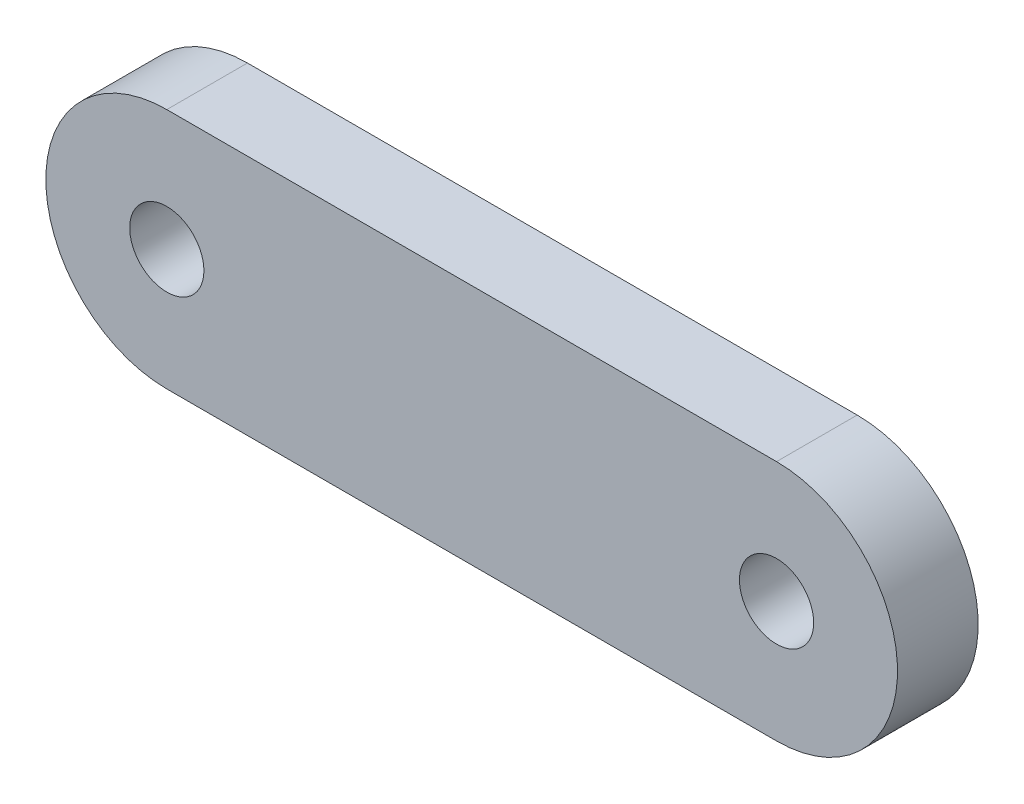
ISO-10303-21;
HEADER;
FILE_DESCRIPTION(('STEP AP214'),'2;1');
FILE_NAME('part.step','',(''),(''),'','','');
FILE_SCHEMA(('AUTOMOTIVE_DESIGN { 1 0 10303 214 1 1 1 1 }'));
ENDSEC;
DATA;
#1=APPLICATION_CONTEXT('core data for automotive mechanical design processes');
#2=APPLICATION_PROTOCOL_DEFINITION('international standard','automotive_design',2000,#1);
#3=PRODUCT_CONTEXT('',#1,'mechanical');
#4=PRODUCT('Part','Part','',(#3));
#5=PRODUCT_RELATED_PRODUCT_CATEGORY('part','',(#4));
#6=PRODUCT_DEFINITION_FORMATION('','',#4);
#7=PRODUCT_DEFINITION_CONTEXT('part definition',#1,'design');
#8=PRODUCT_DEFINITION('design','',#6,#7);
#9=PRODUCT_DEFINITION_SHAPE('','',#8);
#10=(LENGTH_UNIT() NAMED_UNIT(*) SI_UNIT(.MILLI.,.METRE.));
#11=(NAMED_UNIT(*) PLANE_ANGLE_UNIT() SI_UNIT($,.RADIAN.));
#12=(NAMED_UNIT(*) SI_UNIT($,.STERADIAN.) SOLID_ANGLE_UNIT());
#13=UNCERTAINTY_MEASURE_WITH_UNIT(LENGTH_MEASURE(1.E-05),#10,'distance_accuracy_value','');
#14=(GEOMETRIC_REPRESENTATION_CONTEXT(3) GLOBAL_UNCERTAINTY_ASSIGNED_CONTEXT((#13)) GLOBAL_UNIT_ASSIGNED_CONTEXT((#10,
#11,#12)) REPRESENTATION_CONTEXT('',''));
#15=CARTESIAN_POINT('',(0.,0.,0.));
#16=DIRECTION('',(0.,0.,1.));
#17=DIRECTION('',(1.,0.,0.));
#18=AXIS2_PLACEMENT_3D('',#15,#16,#17);
#19=CARTESIAN_POINT('',(18.9,0.,5.));
#20=DIRECTION('',(0.,0.,-1.));
#21=DIRECTION('',(-1.,0.,0.));
#22=AXIS2_PLACEMENT_3D('',#19,#20,#21);
#23=PLANE('',#22);
#24=CARTESIAN_POINT('',(18.9,0.,5.));
#25=DIRECTION('',(0.,0.,1.));
#26=DIRECTION('',(-1.,0.,0.));
#27=AXIS2_PLACEMENT_3D('',#24,#25,#26);
#28=CIRCLE('',#27,7.5);
#29=CARTESIAN_POINT('',(18.9,-7.5,5.));
#30=VERTEX_POINT('',#29);
#31=CARTESIAN_POINT('',(18.9,7.5,5.));
#32=VERTEX_POINT('',#31);
#33=EDGE_CURVE('E87',#30,#32,#28,.T.);
#34=ORIENTED_EDGE('',*,*,#33,.T.);
#35=DIRECTION('',(-1.,0.,0.));
#36=VECTOR('',#35,1.);
#37=CARTESIAN_POINT('',(-18.9,7.5,5.));
#38=LINE('',#37,#36);
#39=CARTESIAN_POINT('',(-18.9,7.5,5.));
#40=VERTEX_POINT('',#39);
#41=EDGE_CURVE('E82',#32,#40,#38,.T.);
#42=ORIENTED_EDGE('',*,*,#41,.T.);
#43=CARTESIAN_POINT('',(-18.9,0.,5.));
#44=DIRECTION('',(0.,0.,1.));
#45=DIRECTION('',(1.,0.,0.));
#46=AXIS2_PLACEMENT_3D('',#43,#44,#45);
#47=CIRCLE('',#46,7.5);
#48=CARTESIAN_POINT('',(-18.9,-7.5,5.));
#49=VERTEX_POINT('',#48);
#50=EDGE_CURVE('E85',#40,#49,#47,.T.);
#51=ORIENTED_EDGE('',*,*,#50,.T.);
#52=DIRECTION('',(1.,0.,0.));
#53=VECTOR('',#52,1.);
#54=CARTESIAN_POINT('',(-18.9,-7.5,5.));
#55=LINE('',#54,#53);
#56=EDGE_CURVE('E52',#49,#30,#55,.T.);
#57=ORIENTED_EDGE('',*,*,#56,.T.);
#58=EDGE_LOOP('',(#34,#42,#51,#57));
#59=FACE_BOUND('',#58,.T.);
#60=CARTESIAN_POINT('',(-18.9,0.,5.));
#61=DIRECTION('',(0.,0.,1.));
#62=DIRECTION('',(1.,0.,0.));
#63=AXIS2_PLACEMENT_3D('',#60,#61,#62);
#64=CIRCLE('',#63,2.29999999999999);
#65=CARTESIAN_POINT('',(-16.6,0.,5.));
#66=VERTEX_POINT('',#65);
#67=EDGE_CURVE('E102',#66,#66,#64,.T.);
#68=ORIENTED_EDGE('',*,*,#67,.F.);
#69=EDGE_LOOP('',(#68));
#70=FACE_BOUND('',#69,.T.);
#71=CARTESIAN_POINT('',(18.9,0.,5.));
#72=DIRECTION('',(0.,0.,1.));
#73=DIRECTION('',(1.,0.,0.));
#74=AXIS2_PLACEMENT_3D('',#71,#72,#73);
#75=CIRCLE('',#74,2.30000000000001);
#76=CARTESIAN_POINT('',(21.2,0.,5.));
#77=VERTEX_POINT('',#76);
#78=EDGE_CURVE('E117',#77,#77,#75,.T.);
#79=ORIENTED_EDGE('',*,*,#78,.F.);
#80=EDGE_LOOP('',(#79));
#81=FACE_BOUND('',#80,.T.);
#82=ADVANCED_FACE('F35',(#59,#70,#81),#23,.F.);
#83=CARTESIAN_POINT('',(18.9,0.,0.));
#84=DIRECTION('',(0.,0.,-1.));
#85=DIRECTION('',(-1.,0.,0.));
#86=AXIS2_PLACEMENT_3D('',#83,#84,#85);
#87=PLANE('',#86);
#88=CARTESIAN_POINT('',(-18.9,0.,0.));
#89=DIRECTION('',(0.,0.,1.));
#90=DIRECTION('',(1.,0.,0.));
#91=AXIS2_PLACEMENT_3D('',#88,#89,#90);
#92=CIRCLE('',#91,2.29999999999999);
#93=CARTESIAN_POINT('',(-16.6,0.,0.));
#94=VERTEX_POINT('',#93);
#95=EDGE_CURVE('E114',#94,#94,#92,.T.);
#96=ORIENTED_EDGE('',*,*,#95,.T.);
#97=EDGE_LOOP('',(#96));
#98=FACE_BOUND('',#97,.T.);
#99=CARTESIAN_POINT('',(18.9,0.,0.));
#100=DIRECTION('',(0.,0.,1.));
#101=DIRECTION('',(-1.,0.,0.));
#102=AXIS2_PLACEMENT_3D('',#99,#100,#101);
#103=CIRCLE('',#102,7.5);
#104=CARTESIAN_POINT('',(18.9,-7.5,0.));
#105=VERTEX_POINT('',#104);
#106=CARTESIAN_POINT('',(18.9,7.5,0.));
#107=VERTEX_POINT('',#106);
#108=EDGE_CURVE('E99',#105,#107,#103,.T.);
#109=ORIENTED_EDGE('',*,*,#108,.F.);
#110=DIRECTION('',(1.,0.,0.));
#111=VECTOR('',#110,1.);
#112=CARTESIAN_POINT('',(-18.9,-7.5,0.));
#113=LINE('',#112,#111);
#114=CARTESIAN_POINT('',(-18.9,-7.5,0.));
#115=VERTEX_POINT('',#114);
#116=EDGE_CURVE('E75',#115,#105,#113,.T.);
#117=ORIENTED_EDGE('',*,*,#116,.F.);
#118=CARTESIAN_POINT('',(-18.9,0.,0.));
#119=DIRECTION('',(0.,0.,1.));
#120=DIRECTION('',(1.,0.,0.));
#121=AXIS2_PLACEMENT_3D('',#118,#119,#120);
#122=CIRCLE('',#121,7.5);
#123=CARTESIAN_POINT('',(-18.9,7.5,0.));
#124=VERTEX_POINT('',#123);
#125=EDGE_CURVE('E69',#124,#115,#122,.T.);
#126=ORIENTED_EDGE('',*,*,#125,.F.);
#127=DIRECTION('',(-1.,0.,0.));
#128=VECTOR('',#127,1.);
#129=CARTESIAN_POINT('',(-18.9,7.5,0.));
#130=LINE('',#129,#128);
#131=EDGE_CURVE('E91',#107,#124,#130,.T.);
#132=ORIENTED_EDGE('',*,*,#131,.F.);
#133=EDGE_LOOP('',(#109,#117,#126,#132));
#134=FACE_BOUND('',#133,.T.);
#135=CARTESIAN_POINT('',(18.9,0.,0.));
#136=DIRECTION('',(0.,0.,1.));
#137=DIRECTION('',(1.,0.,0.));
#138=AXIS2_PLACEMENT_3D('',#135,#136,#137);
#139=CIRCLE('',#138,2.30000000000001);
#140=CARTESIAN_POINT('',(21.2,0.,0.));
#141=VERTEX_POINT('',#140);
#142=EDGE_CURVE('E120',#141,#141,#139,.T.);
#143=ORIENTED_EDGE('',*,*,#142,.T.);
#144=EDGE_LOOP('',(#143));
#145=FACE_BOUND('',#144,.T.);
#146=ADVANCED_FACE('F110',(#98,#134,#145),#87,.T.);
#147=CARTESIAN_POINT('',(18.9,0.,5.));
#148=DIRECTION('',(0.,0.,-1.));
#149=DIRECTION('',(-1.,0.,0.));
#150=AXIS2_PLACEMENT_3D('',#147,#148,#149);
#151=CYLINDRICAL_SURFACE('',#150,7.5);
#152=ORIENTED_EDGE('',*,*,#108,.T.);
#153=DIRECTION('',(0.,0.,-1.));
#154=VECTOR('',#153,1.);
#155=CARTESIAN_POINT('',(18.9,7.5,5.));
#156=LINE('',#155,#154);
#157=EDGE_CURVE('E11',#32,#107,#156,.T.);
#158=ORIENTED_EDGE('',*,*,#157,.F.);
#159=ORIENTED_EDGE('',*,*,#33,.F.);
#160=DIRECTION('',(0.,0.,-1.));
#161=VECTOR('',#160,1.);
#162=CARTESIAN_POINT('',(18.9,-7.5,5.));
#163=LINE('',#162,#161);
#164=EDGE_CURVE('E95',#30,#105,#163,.T.);
#165=ORIENTED_EDGE('',*,*,#164,.T.);
#166=EDGE_LOOP('',(#152,#158,#159,#165));
#167=FACE_BOUND('',#166,.T.);
#168=ADVANCED_FACE('F37',(#167),#151,.T.);
#169=CARTESIAN_POINT('',(-18.9,7.5,5.));
#170=DIRECTION('',(0.,-1.,0.));
#171=DIRECTION('',(0.,0.,-1.));
#172=AXIS2_PLACEMENT_3D('',#169,#170,#171);
#173=PLANE('',#172);
#174=ORIENTED_EDGE('',*,*,#131,.T.);
#175=DIRECTION('',(0.,0.,-1.));
#176=VECTOR('',#175,1.);
#177=CARTESIAN_POINT('',(-18.9,7.5,5.));
#178=LINE('',#177,#176);
#179=EDGE_CURVE('E44',#40,#124,#178,.T.);
#180=ORIENTED_EDGE('',*,*,#179,.F.);
#181=ORIENTED_EDGE('',*,*,#41,.F.);
#182=ORIENTED_EDGE('',*,*,#157,.T.);
#183=EDGE_LOOP('',(#174,#180,#181,#182));
#184=FACE_BOUND('',#183,.T.);
#185=ADVANCED_FACE('F90',(#184),#173,.F.);
#186=CARTESIAN_POINT('',(-18.9,0.,5.));
#187=DIRECTION('',(0.,0.,-1.));
#188=DIRECTION('',(-1.,0.,0.));
#189=AXIS2_PLACEMENT_3D('',#186,#187,#188);
#190=CYLINDRICAL_SURFACE('',#189,7.5);
#191=ORIENTED_EDGE('',*,*,#125,.T.);
#192=DIRECTION('',(0.,0.,-1.));
#193=VECTOR('',#192,1.);
#194=CARTESIAN_POINT('',(-18.9,-7.5,5.));
#195=LINE('',#194,#193);
#196=EDGE_CURVE('E92',#49,#115,#195,.T.);
#197=ORIENTED_EDGE('',*,*,#196,.F.);
#198=ORIENTED_EDGE('',*,*,#50,.F.);
#199=ORIENTED_EDGE('',*,*,#179,.T.);
#200=EDGE_LOOP('',(#191,#197,#198,#199));
#201=FACE_BOUND('',#200,.T.);
#202=ADVANCED_FACE('F93',(#201),#190,.T.);
#203=CARTESIAN_POINT('',(-18.9,-7.5,5.));
#204=DIRECTION('',(0.,1.,0.));
#205=DIRECTION('',(0.,0.,1.));
#206=AXIS2_PLACEMENT_3D('',#203,#204,#205);
#207=PLANE('',#206);
#208=ORIENTED_EDGE('',*,*,#116,.T.);
#209=ORIENTED_EDGE('',*,*,#164,.F.);
#210=ORIENTED_EDGE('',*,*,#56,.F.);
#211=ORIENTED_EDGE('',*,*,#196,.T.);
#212=EDGE_LOOP('',(#208,#209,#210,#211));
#213=FACE_BOUND('',#212,.T.);
#214=ADVANCED_FACE('F107',(#213),#207,.F.);
#215=CARTESIAN_POINT('',(-18.9,0.,5.));
#216=DIRECTION('',(0.,0.,-1.));
#217=DIRECTION('',(-1.,0.,0.));
#218=AXIS2_PLACEMENT_3D('',#215,#216,#217);
#219=CYLINDRICAL_SURFACE('',#218,2.29999999999999);
#220=ORIENTED_EDGE('',*,*,#67,.T.);
#221=EDGE_LOOP('',(#220));
#222=FACE_BOUND('',#221,.T.);
#223=ORIENTED_EDGE('',*,*,#95,.F.);
#224=EDGE_LOOP('',(#223));
#225=FACE_BOUND('',#224,.T.);
#226=ADVANCED_FACE('F137',(#222,#225),#219,.F.);
#227=CARTESIAN_POINT('',(18.9,0.,5.));
#228=DIRECTION('',(0.,0.,-1.));
#229=DIRECTION('',(-1.,0.,0.));
#230=AXIS2_PLACEMENT_3D('',#227,#228,#229);
#231=CYLINDRICAL_SURFACE('',#230,2.30000000000001);
#232=ORIENTED_EDGE('',*,*,#78,.T.);
#233=EDGE_LOOP('',(#232));
#234=FACE_BOUND('',#233,.T.);
#235=ORIENTED_EDGE('',*,*,#142,.F.);
#236=EDGE_LOOP('',(#235));
#237=FACE_BOUND('',#236,.T.);
#238=ADVANCED_FACE('F126',(#234,#237),#231,.F.);
#239=CLOSED_SHELL('',(#82,#146,#168,#185,#202,#214,#226,#238));
#240=MANIFOLD_SOLID_BREP('B2',#239);
#241=ADVANCED_BREP_SHAPE_REPRESENTATION('',(#18,#240),#14);
#242=SHAPE_DEFINITION_REPRESENTATION(#9,#241);
ENDSEC;
END-ISO-10303-21;
